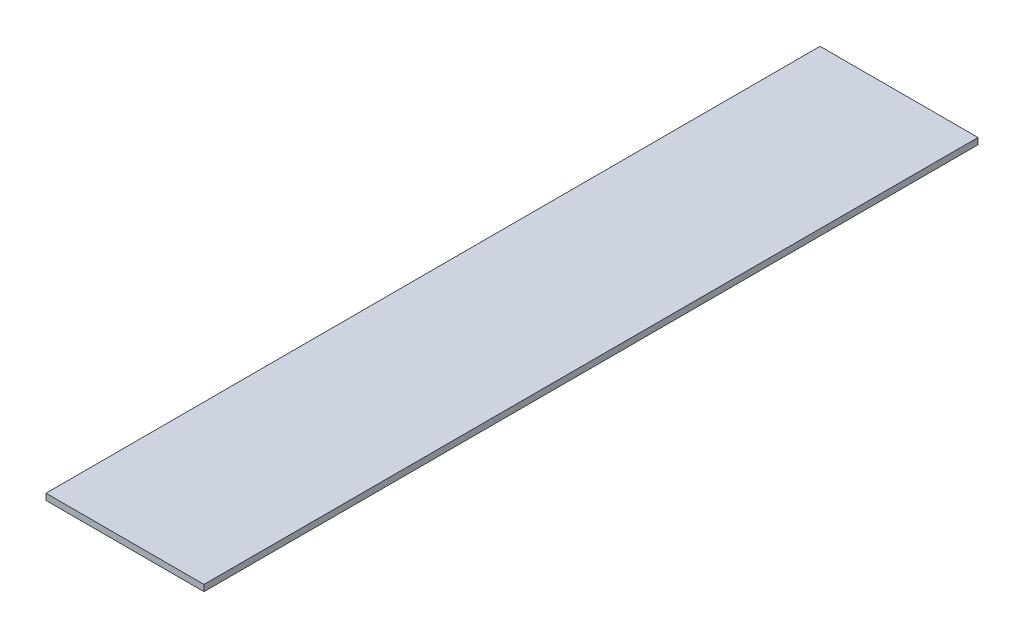
ISO-10303-21;
HEADER;
FILE_DESCRIPTION(('STEP AP214'),'2;1');
FILE_NAME('part.step','',(''),(''),'','','');
FILE_SCHEMA(('AUTOMOTIVE_DESIGN { 1 0 10303 214 1 1 1 1 }'));
ENDSEC;
DATA;
#1=APPLICATION_CONTEXT('core data for automotive mechanical design processes');
#2=APPLICATION_PROTOCOL_DEFINITION('international standard','automotive_design',2000,#1);
#3=PRODUCT_CONTEXT('',#1,'mechanical');
#4=PRODUCT('Part','Part','',(#3));
#5=PRODUCT_RELATED_PRODUCT_CATEGORY('part','',(#4));
#6=PRODUCT_DEFINITION_FORMATION('','',#4);
#7=PRODUCT_DEFINITION_CONTEXT('part definition',#1,'design');
#8=PRODUCT_DEFINITION('design','',#6,#7);
#9=PRODUCT_DEFINITION_SHAPE('','',#8);
#10=(LENGTH_UNIT() NAMED_UNIT(*) SI_UNIT(.MILLI.,.METRE.));
#11=(NAMED_UNIT(*) PLANE_ANGLE_UNIT() SI_UNIT($,.RADIAN.));
#12=(NAMED_UNIT(*) SI_UNIT($,.STERADIAN.) SOLID_ANGLE_UNIT());
#13=UNCERTAINTY_MEASURE_WITH_UNIT(LENGTH_MEASURE(1.E-05),#10,'distance_accuracy_value','');
#14=(GEOMETRIC_REPRESENTATION_CONTEXT(3) GLOBAL_UNCERTAINTY_ASSIGNED_CONTEXT((#13)) GLOBAL_UNIT_ASSIGNED_CONTEXT((#10,
#11,#12)) REPRESENTATION_CONTEXT('',''));
#15=CARTESIAN_POINT('',(0.,0.,0.));
#16=DIRECTION('',(0.,0.,1.));
#17=DIRECTION('',(1.,0.,0.));
#18=AXIS2_PLACEMENT_3D('',#15,#16,#17);
#19=CARTESIAN_POINT('',(0.,2.,0.));
#20=DIRECTION('',(1.,0.,0.));
#21=DIRECTION('',(0.,0.,-1.));
#22=AXIS2_PLACEMENT_3D('',#19,#20,#21);
#23=PLANE('',#22);
#24=DIRECTION('',(0.,0.,1.));
#25=VECTOR('',#24,1.);
#26=CARTESIAN_POINT('',(0.,0.,0.));
#27=LINE('',#26,#25);
#28=CARTESIAN_POINT('',(0.,0.,-245.));
#29=VERTEX_POINT('',#28);
#30=CARTESIAN_POINT('',(0.,0.,0.));
#31=VERTEX_POINT('',#30);
#32=EDGE_CURVE('E99',#29,#31,#27,.T.);
#33=ORIENTED_EDGE('',*,*,#32,.T.);
#34=DIRECTION('',(0.,-1.,0.));
#35=VECTOR('',#34,1.);
#36=CARTESIAN_POINT('',(0.,2.,0.));
#37=LINE('',#36,#35);
#38=CARTESIAN_POINT('',(0.,2.,0.));
#39=VERTEX_POINT('',#38);
#40=EDGE_CURVE('E11',#39,#31,#37,.T.);
#41=ORIENTED_EDGE('',*,*,#40,.F.);
#42=DIRECTION('',(0.,0.,1.));
#43=VECTOR('',#42,1.);
#44=CARTESIAN_POINT('',(0.,2.,0.));
#45=LINE('',#44,#43);
#46=CARTESIAN_POINT('',(0.,2.,-245.));
#47=VERTEX_POINT('',#46);
#48=EDGE_CURVE('E87',#47,#39,#45,.T.);
#49=ORIENTED_EDGE('',*,*,#48,.F.);
#50=DIRECTION('',(0.,-1.,0.));
#51=VECTOR('',#50,1.);
#52=CARTESIAN_POINT('',(0.,2.,-245.));
#53=LINE('',#52,#51);
#54=EDGE_CURVE('E95',#47,#29,#53,.T.);
#55=ORIENTED_EDGE('',*,*,#54,.T.);
#56=EDGE_LOOP('',(#33,#41,#49,#55));
#57=FACE_BOUND('',#56,.T.);
#58=ADVANCED_FACE('F36',(#57),#23,.F.);
#59=CARTESIAN_POINT('',(0.,2.,0.));
#60=DIRECTION('',(0.,0.,-1.));
#61=DIRECTION('',(-1.,0.,0.));
#62=AXIS2_PLACEMENT_3D('',#59,#60,#61);
#63=PLANE('',#62);
#64=DIRECTION('',(1.,0.,0.));
#65=VECTOR('',#64,1.);
#66=CARTESIAN_POINT('',(0.,0.,0.));
#67=LINE('',#66,#65);
#68=CARTESIAN_POINT('',(50.,0.,0.));
#69=VERTEX_POINT('',#68);
#70=EDGE_CURVE('E91',#31,#69,#67,.T.);
#71=ORIENTED_EDGE('',*,*,#70,.T.);
#72=DIRECTION('',(0.,-1.,0.));
#73=VECTOR('',#72,1.);
#74=CARTESIAN_POINT('',(50.,2.,0.));
#75=LINE('',#74,#73);
#76=CARTESIAN_POINT('',(50.,2.,0.));
#77=VERTEX_POINT('',#76);
#78=EDGE_CURVE('E44',#77,#69,#75,.T.);
#79=ORIENTED_EDGE('',*,*,#78,.F.);
#80=DIRECTION('',(1.,0.,0.));
#81=VECTOR('',#80,1.);
#82=CARTESIAN_POINT('',(0.,2.,0.));
#83=LINE('',#82,#81);
#84=EDGE_CURVE('E82',#39,#77,#83,.T.);
#85=ORIENTED_EDGE('',*,*,#84,.F.);
#86=ORIENTED_EDGE('',*,*,#40,.T.);
#87=EDGE_LOOP('',(#71,#79,#85,#86));
#88=FACE_BOUND('',#87,.T.);
#89=ADVANCED_FACE('F90',(#88),#63,.F.);
#90=CARTESIAN_POINT('',(50.,2.,0.));
#91=DIRECTION('',(-1.,0.,0.));
#92=DIRECTION('',(0.,0.,1.));
#93=AXIS2_PLACEMENT_3D('',#90,#91,#92);
#94=PLANE('',#93);
#95=DIRECTION('',(0.,0.,-1.));
#96=VECTOR('',#95,1.);
#97=CARTESIAN_POINT('',(50.,0.,0.));
#98=LINE('',#97,#96);
#99=CARTESIAN_POINT('',(50.,0.,-245.));
#100=VERTEX_POINT('',#99);
#101=EDGE_CURVE('E69',#69,#100,#98,.T.);
#102=ORIENTED_EDGE('',*,*,#101,.T.);
#103=DIRECTION('',(0.,-1.,0.));
#104=VECTOR('',#103,1.);
#105=CARTESIAN_POINT('',(50.,2.,-245.));
#106=LINE('',#105,#104);
#107=CARTESIAN_POINT('',(50.,2.,-245.));
#108=VERTEX_POINT('',#107);
#109=EDGE_CURVE('E92',#108,#100,#106,.T.);
#110=ORIENTED_EDGE('',*,*,#109,.F.);
#111=DIRECTION('',(0.,0.,-1.));
#112=VECTOR('',#111,1.);
#113=CARTESIAN_POINT('',(50.,2.,0.));
#114=LINE('',#113,#112);
#115=EDGE_CURVE('E85',#77,#108,#114,.T.);
#116=ORIENTED_EDGE('',*,*,#115,.F.);
#117=ORIENTED_EDGE('',*,*,#78,.T.);
#118=EDGE_LOOP('',(#102,#110,#116,#117));
#119=FACE_BOUND('',#118,.T.);
#120=ADVANCED_FACE('F93',(#119),#94,.F.);
#121=CARTESIAN_POINT('',(0.,2.,-245.));
#122=DIRECTION('',(0.,0.,1.));
#123=DIRECTION('',(1.,0.,0.));
#124=AXIS2_PLACEMENT_3D('',#121,#122,#123);
#125=PLANE('',#124);
#126=DIRECTION('',(-1.,0.,0.));
#127=VECTOR('',#126,1.);
#128=CARTESIAN_POINT('',(0.,0.,-245.));
#129=LINE('',#128,#127);
#130=EDGE_CURVE('E75',#100,#29,#129,.T.);
#131=ORIENTED_EDGE('',*,*,#130,.T.);
#132=ORIENTED_EDGE('',*,*,#54,.F.);
#133=DIRECTION('',(-1.,0.,0.));
#134=VECTOR('',#133,1.);
#135=CARTESIAN_POINT('',(0.,2.,-245.));
#136=LINE('',#135,#134);
#137=EDGE_CURVE('E52',#108,#47,#136,.T.);
#138=ORIENTED_EDGE('',*,*,#137,.F.);
#139=ORIENTED_EDGE('',*,*,#109,.T.);
#140=EDGE_LOOP('',(#131,#132,#138,#139));
#141=FACE_BOUND('',#140,.T.);
#142=ADVANCED_FACE('F106',(#141),#125,.F.);
#143=CARTESIAN_POINT('',(0.,2.,0.));
#144=DIRECTION('',(0.,-1.,0.));
#145=DIRECTION('',(0.,0.,-1.));
#146=AXIS2_PLACEMENT_3D('',#143,#144,#145);
#147=PLANE('',#146);
#148=ORIENTED_EDGE('',*,*,#48,.T.);
#149=ORIENTED_EDGE('',*,*,#84,.T.);
#150=ORIENTED_EDGE('',*,*,#115,.T.);
#151=ORIENTED_EDGE('',*,*,#137,.T.);
#152=EDGE_LOOP('',(#148,#149,#150,#151));
#153=FACE_BOUND('',#152,.T.);
#154=ADVANCED_FACE('F83',(#153),#147,.F.);
#155=CARTESIAN_POINT('',(0.,0.,0.));
#156=DIRECTION('',(0.,-1.,0.));
#157=DIRECTION('',(0.,0.,-1.));
#158=AXIS2_PLACEMENT_3D('',#155,#156,#157);
#159=PLANE('',#158);
#160=ORIENTED_EDGE('',*,*,#32,.F.);
#161=ORIENTED_EDGE('',*,*,#130,.F.);
#162=ORIENTED_EDGE('',*,*,#101,.F.);
#163=ORIENTED_EDGE('',*,*,#70,.F.);
#164=EDGE_LOOP('',(#160,#161,#162,#163));
#165=FACE_BOUND('',#164,.T.);
#166=ADVANCED_FACE('F109',(#165),#159,.T.);
#167=CLOSED_SHELL('',(#58,#89,#120,#142,#154,#166));
#168=MANIFOLD_SOLID_BREP('B2',#167);
#169=ADVANCED_BREP_SHAPE_REPRESENTATION('',(#18,#168),#14);
#170=SHAPE_DEFINITION_REPRESENTATION(#9,#169);
ENDSEC;
END-ISO-10303-21;
